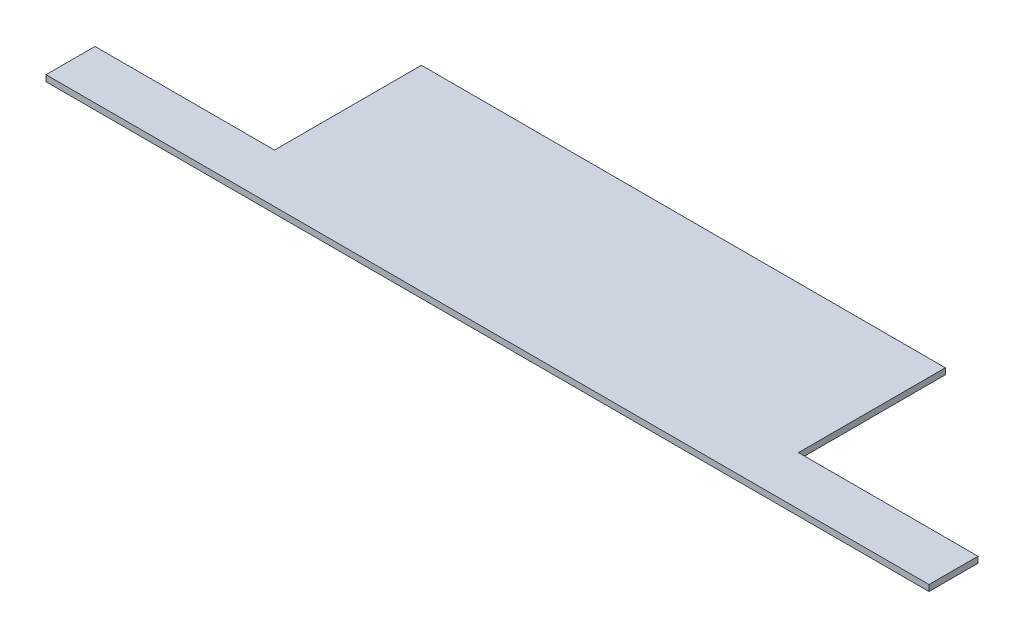
ISO-10303-21;
HEADER;
FILE_DESCRIPTION(('STEP AP214'),'2;1');
FILE_NAME('part.step','',(''),(''),'','','');
FILE_SCHEMA(('AUTOMOTIVE_DESIGN { 1 0 10303 214 1 1 1 1 }'));
ENDSEC;
DATA;
#1=APPLICATION_CONTEXT('core data for automotive mechanical design processes');
#2=APPLICATION_PROTOCOL_DEFINITION('international standard','automotive_design',2000,#1);
#3=PRODUCT_CONTEXT('',#1,'mechanical');
#4=PRODUCT('Part','Part','',(#3));
#5=PRODUCT_RELATED_PRODUCT_CATEGORY('part','',(#4));
#6=PRODUCT_DEFINITION_FORMATION('','',#4);
#7=PRODUCT_DEFINITION_CONTEXT('part definition',#1,'design');
#8=PRODUCT_DEFINITION('design','',#6,#7);
#9=PRODUCT_DEFINITION_SHAPE('','',#8);
#10=(LENGTH_UNIT() NAMED_UNIT(*) SI_UNIT(.MILLI.,.METRE.));
#11=(NAMED_UNIT(*) PLANE_ANGLE_UNIT() SI_UNIT($,.RADIAN.));
#12=(NAMED_UNIT(*) SI_UNIT($,.STERADIAN.) SOLID_ANGLE_UNIT());
#13=UNCERTAINTY_MEASURE_WITH_UNIT(LENGTH_MEASURE(1.E-05),#10,'distance_accuracy_value','');
#14=(GEOMETRIC_REPRESENTATION_CONTEXT(3) GLOBAL_UNCERTAINTY_ASSIGNED_CONTEXT((#13)) GLOBAL_UNIT_ASSIGNED_CONTEXT((#10,
#11,#12)) REPRESENTATION_CONTEXT('',''));
#15=CARTESIAN_POINT('',(0.,0.,0.));
#16=DIRECTION('',(0.,0.,1.));
#17=DIRECTION('',(1.,0.,0.));
#18=AXIS2_PLACEMENT_3D('',#15,#16,#17);
#19=CARTESIAN_POINT('',(342.899703373438,4.7625,38.4034282048035));
#20=DIRECTION('',(-1.,0.,0.));
#21=DIRECTION('',(0.,0.,1.));
#22=AXIS2_PLACEMENT_3D('',#19,#20,#21);
#23=PLANE('',#22);
#24=DIRECTION('',(0.,0.,-1.));
#25=VECTOR('',#24,1.);
#26=CARTESIAN_POINT('',(342.899703373438,0.,38.4034282048035));
#27=LINE('',#26,#25);
#28=CARTESIAN_POINT('',(342.899703373438,0.,38.4034282048035));
#29=VERTEX_POINT('',#28);
#30=CARTESIAN_POINT('',(342.899703373438,0.,0.303428204803525));
#31=VERTEX_POINT('',#30);
#32=EDGE_CURVE('E140',#29,#31,#27,.T.);
#33=ORIENTED_EDGE('',*,*,#32,.T.);
#34=DIRECTION('',(0.,-1.,0.));
#35=VECTOR('',#34,1.);
#36=CARTESIAN_POINT('',(342.899703373438,4.7625,0.303428204803525));
#37=LINE('',#36,#35);
#38=CARTESIAN_POINT('',(342.899703373438,4.7625,0.303428204803525));
#39=VERTEX_POINT('',#38);
#40=EDGE_CURVE('E11',#39,#31,#37,.T.);
#41=ORIENTED_EDGE('',*,*,#40,.F.);
#42=DIRECTION('',(0.,0.,-1.));
#43=VECTOR('',#42,1.);
#44=CARTESIAN_POINT('',(342.899703373438,4.7625,38.4034282048035));
#45=LINE('',#44,#43);
#46=CARTESIAN_POINT('',(342.899703373438,4.7625,38.4034282048035));
#47=VERTEX_POINT('',#46);
#48=EDGE_CURVE('E162',#47,#39,#45,.T.);
#49=ORIENTED_EDGE('',*,*,#48,.F.);
#50=DIRECTION('',(0.,-1.,0.));
#51=VECTOR('',#50,1.);
#52=CARTESIAN_POINT('',(342.899703373438,4.7625,38.4034282048035));
#53=LINE('',#52,#51);
#54=EDGE_CURVE('E136',#47,#29,#53,.T.);
#55=ORIENTED_EDGE('',*,*,#54,.T.);
#56=EDGE_LOOP('',(#33,#41,#49,#55));
#57=FACE_BOUND('',#56,.T.);
#58=ADVANCED_FACE('F39',(#57),#23,.F.);
#59=CARTESIAN_POINT('',(342.899703373438,4.7625,0.303428204803525));
#60=DIRECTION('',(0.,0.,1.));
#61=DIRECTION('',(1.,0.,0.));
#62=AXIS2_PLACEMENT_3D('',#59,#60,#61);
#63=PLANE('',#62);
#64=DIRECTION('',(-1.,0.,0.));
#65=VECTOR('',#64,1.);
#66=CARTESIAN_POINT('',(342.899703373438,0.,0.303428204803525));
#67=LINE('',#66,#65);
#68=CARTESIAN_POINT('',(203.199703373438,0.,0.303428204803543));
#69=VERTEX_POINT('',#68);
#70=EDGE_CURVE('E144',#31,#69,#67,.T.);
#71=ORIENTED_EDGE('',*,*,#70,.T.);
#72=DIRECTION('',(0.,-1.,0.));
#73=VECTOR('',#72,1.);
#74=CARTESIAN_POINT('',(203.199703373438,4.7625,0.303428204803543));
#75=LINE('',#74,#73);
#76=CARTESIAN_POINT('',(203.199703373438,4.7625,0.303428204803543));
#77=VERTEX_POINT('',#76);
#78=EDGE_CURVE('E48',#77,#69,#75,.T.);
#79=ORIENTED_EDGE('',*,*,#78,.F.);
#80=DIRECTION('',(-1.,0.,0.));
#81=VECTOR('',#80,1.);
#82=CARTESIAN_POINT('',(342.899703373438,4.7625,0.303428204803525));
#83=LINE('',#82,#81);
#84=EDGE_CURVE('E99',#39,#77,#83,.T.);
#85=ORIENTED_EDGE('',*,*,#84,.F.);
#86=ORIENTED_EDGE('',*,*,#40,.T.);
#87=EDGE_LOOP('',(#71,#79,#85,#86));
#88=FACE_BOUND('',#87,.T.);
#89=ADVANCED_FACE('F208',(#88),#63,.F.);
#90=CARTESIAN_POINT('',(203.199703373438,4.7625,-113.996571795197));
#91=DIRECTION('',(-1.,0.,0.));
#92=DIRECTION('',(0.,0.,1.));
#93=AXIS2_PLACEMENT_3D('',#90,#91,#92);
#94=PLANE('',#93);
#95=DIRECTION('',(0.,0.,-1.));
#96=VECTOR('',#95,1.);
#97=CARTESIAN_POINT('',(203.199703373438,0.,-113.996571795197));
#98=LINE('',#97,#96);
#99=CARTESIAN_POINT('',(203.199703373438,0.,-113.996571795197));
#100=VERTEX_POINT('',#99);
#101=EDGE_CURVE('E147',#69,#100,#98,.T.);
#102=ORIENTED_EDGE('',*,*,#101,.T.);
#103=DIRECTION('',(0.,-1.,0.));
#104=VECTOR('',#103,1.);
#105=CARTESIAN_POINT('',(203.199703373438,4.7625,-113.996571795197));
#106=LINE('',#105,#104);
#107=CARTESIAN_POINT('',(203.199703373438,4.7625,-113.996571795197));
#108=VERTEX_POINT('',#107);
#109=EDGE_CURVE('E173',#108,#100,#106,.T.);
#110=ORIENTED_EDGE('',*,*,#109,.F.);
#111=DIRECTION('',(0.,0.,-1.));
#112=VECTOR('',#111,1.);
#113=CARTESIAN_POINT('',(203.199703373438,4.7625,-113.996571795197));
#114=LINE('',#113,#112);
#115=EDGE_CURVE('E183',#77,#108,#114,.T.);
#116=ORIENTED_EDGE('',*,*,#115,.F.);
#117=ORIENTED_EDGE('',*,*,#78,.T.);
#118=EDGE_LOOP('',(#102,#110,#116,#117));
#119=FACE_BOUND('',#118,.T.);
#120=ADVANCED_FACE('F181',(#119),#94,.F.);
#121=CARTESIAN_POINT('',(203.199703373438,4.7625,-113.996571795197));
#122=DIRECTION('',(0.,0.,1.));
#123=DIRECTION('',(1.,0.,0.));
#124=AXIS2_PLACEMENT_3D('',#121,#122,#123);
#125=PLANE('',#124);
#126=DIRECTION('',(-1.,0.,0.));
#127=VECTOR('',#126,1.);
#128=CARTESIAN_POINT('',(203.199703373438,0.,-113.996571795197));
#129=LINE('',#128,#127);
#130=CARTESIAN_POINT('',(-204.511504346364,0.,-113.996571795196));
#131=VERTEX_POINT('',#130);
#132=EDGE_CURVE('E150',#100,#131,#129,.T.);
#133=ORIENTED_EDGE('',*,*,#132,.T.);
#134=DIRECTION('',(0.,-1.,0.));
#135=VECTOR('',#134,1.);
#136=CARTESIAN_POINT('',(-204.511504346364,4.7625,-113.996571795196));
#137=LINE('',#136,#135);
#138=CARTESIAN_POINT('',(-204.511504346364,4.7625,-113.996571795196));
#139=VERTEX_POINT('',#138);
#140=EDGE_CURVE('E169',#139,#131,#137,.T.);
#141=ORIENTED_EDGE('',*,*,#140,.F.);
#142=DIRECTION('',(-1.,0.,0.));
#143=VECTOR('',#142,1.);
#144=CARTESIAN_POINT('',(203.199703373438,4.7625,-113.996571795197));
#145=LINE('',#144,#143);
#146=EDGE_CURVE('E196',#108,#139,#145,.T.);
#147=ORIENTED_EDGE('',*,*,#146,.F.);
#148=ORIENTED_EDGE('',*,*,#109,.T.);
#149=EDGE_LOOP('',(#133,#141,#147,#148));
#150=FACE_BOUND('',#149,.T.);
#151=ADVANCED_FACE('F191',(#150),#125,.F.);
#152=CARTESIAN_POINT('',(-204.511504346364,4.7625,-113.996571795196));
#153=DIRECTION('',(1.,0.,0.));
#154=DIRECTION('',(0.,0.,-1.));
#155=AXIS2_PLACEMENT_3D('',#152,#153,#154);
#156=PLANE('',#155);
#157=DIRECTION('',(0.,0.,1.));
#158=VECTOR('',#157,1.);
#159=CARTESIAN_POINT('',(-204.511504346364,0.,-113.996571795196));
#160=LINE('',#159,#158);
#161=CARTESIAN_POINT('',(-204.511504346364,0.,0.303428204803525));
#162=VERTEX_POINT('',#161);
#163=EDGE_CURVE('E153',#131,#162,#160,.T.);
#164=ORIENTED_EDGE('',*,*,#163,.T.);
#165=DIRECTION('',(0.,-1.,0.));
#166=VECTOR('',#165,1.);
#167=CARTESIAN_POINT('',(-204.511504346364,4.7625,0.303428204803525));
#168=LINE('',#167,#166);
#169=CARTESIAN_POINT('',(-204.511504346364,4.7625,0.303428204803525));
#170=VERTEX_POINT('',#169);
#171=EDGE_CURVE('E129',#170,#162,#168,.T.);
#172=ORIENTED_EDGE('',*,*,#171,.F.);
#173=DIRECTION('',(0.,0.,1.));
#174=VECTOR('',#173,1.);
#175=CARTESIAN_POINT('',(-204.511504346364,4.7625,-113.996571795196));
#176=LINE('',#175,#174);
#177=EDGE_CURVE('E118',#139,#170,#176,.T.);
#178=ORIENTED_EDGE('',*,*,#177,.F.);
#179=ORIENTED_EDGE('',*,*,#140,.T.);
#180=EDGE_LOOP('',(#164,#172,#178,#179));
#181=FACE_BOUND('',#180,.T.);
#182=ADVANCED_FACE('F194',(#181),#156,.F.);
#183=CARTESIAN_POINT('',(-344.211504346364,4.7625,0.303428204803525));
#184=DIRECTION('',(0.,0.,1.));
#185=DIRECTION('',(1.,0.,0.));
#186=AXIS2_PLACEMENT_3D('',#183,#184,#185);
#187=PLANE('',#186);
#188=DIRECTION('',(-1.,0.,0.));
#189=VECTOR('',#188,1.);
#190=CARTESIAN_POINT('',(-344.211504346364,0.,0.303428204803525));
#191=LINE('',#190,#189);
#192=CARTESIAN_POINT('',(-344.211504346364,0.,0.303428204803525));
#193=VERTEX_POINT('',#192);
#194=EDGE_CURVE('E127',#162,#193,#191,.T.);
#195=ORIENTED_EDGE('',*,*,#194,.T.);
#196=DIRECTION('',(0.,-1.,0.));
#197=VECTOR('',#196,1.);
#198=CARTESIAN_POINT('',(-344.211504346364,4.7625,0.303428204803525));
#199=LINE('',#198,#197);
#200=CARTESIAN_POINT('',(-344.211504346364,4.7625,0.303428204803525));
#201=VERTEX_POINT('',#200);
#202=EDGE_CURVE('E124',#201,#193,#199,.T.);
#203=ORIENTED_EDGE('',*,*,#202,.F.);
#204=DIRECTION('',(-1.,0.,0.));
#205=VECTOR('',#204,1.);
#206=CARTESIAN_POINT('',(-344.211504346364,4.7625,0.303428204803525));
#207=LINE('',#206,#205);
#208=EDGE_CURVE('E112',#170,#201,#207,.T.);
#209=ORIENTED_EDGE('',*,*,#208,.F.);
#210=ORIENTED_EDGE('',*,*,#171,.T.);
#211=EDGE_LOOP('',(#195,#203,#209,#210));
#212=FACE_BOUND('',#211,.T.);
#213=ADVANCED_FACE('F125',(#212),#187,.F.);
#214=CARTESIAN_POINT('',(-344.211504346364,4.7625,38.4034282048036));
#215=DIRECTION('',(1.,0.,0.));
#216=DIRECTION('',(0.,0.,-1.));
#217=AXIS2_PLACEMENT_3D('',#214,#215,#216);
#218=PLANE('',#217);
#219=DIRECTION('',(0.,0.,1.));
#220=VECTOR('',#219,1.);
#221=CARTESIAN_POINT('',(-344.211504346364,0.,38.4034282048036));
#222=LINE('',#221,#220);
#223=CARTESIAN_POINT('',(-344.211504346364,0.,38.4034282048036));
#224=VERTEX_POINT('',#223);
#225=EDGE_CURVE('E85',#193,#224,#222,.T.);
#226=ORIENTED_EDGE('',*,*,#225,.T.);
#227=DIRECTION('',(0.,-1.,0.));
#228=VECTOR('',#227,1.);
#229=CARTESIAN_POINT('',(-344.211504346364,4.7625,38.4034282048036));
#230=LINE('',#229,#228);
#231=CARTESIAN_POINT('',(-344.211504346364,4.7625,38.4034282048036));
#232=VERTEX_POINT('',#231);
#233=EDGE_CURVE('E130',#232,#224,#230,.T.);
#234=ORIENTED_EDGE('',*,*,#233,.F.);
#235=DIRECTION('',(0.,0.,1.));
#236=VECTOR('',#235,1.);
#237=CARTESIAN_POINT('',(-344.211504346364,4.7625,38.4034282048036));
#238=LINE('',#237,#236);
#239=EDGE_CURVE('E116',#201,#232,#238,.T.);
#240=ORIENTED_EDGE('',*,*,#239,.F.);
#241=ORIENTED_EDGE('',*,*,#202,.T.);
#242=EDGE_LOOP('',(#226,#234,#240,#241));
#243=FACE_BOUND('',#242,.T.);
#244=ADVANCED_FACE('F132',(#243),#218,.F.);
#245=CARTESIAN_POINT('',(342.899703373438,4.7625,38.4034282048035));
#246=DIRECTION('',(0.,0.,-1.));
#247=DIRECTION('',(-1.,0.,0.));
#248=AXIS2_PLACEMENT_3D('',#245,#246,#247);
#249=PLANE('',#248);
#250=DIRECTION('',(1.,0.,0.));
#251=VECTOR('',#250,1.);
#252=CARTESIAN_POINT('',(342.899703373438,0.,38.4034282048035));
#253=LINE('',#252,#251);
#254=EDGE_CURVE('E91',#224,#29,#253,.T.);
#255=ORIENTED_EDGE('',*,*,#254,.T.);
#256=ORIENTED_EDGE('',*,*,#54,.F.);
#257=DIRECTION('',(1.,0.,0.));
#258=VECTOR('',#257,1.);
#259=CARTESIAN_POINT('',(342.899703373438,4.7625,38.4034282048035));
#260=LINE('',#259,#258);
#261=EDGE_CURVE('E56',#232,#47,#260,.T.);
#262=ORIENTED_EDGE('',*,*,#261,.F.);
#263=ORIENTED_EDGE('',*,*,#233,.T.);
#264=EDGE_LOOP('',(#255,#256,#262,#263));
#265=FACE_BOUND('',#264,.T.);
#266=ADVANCED_FACE('F224',(#265),#249,.F.);
#267=CARTESIAN_POINT('',(0.,4.7625,0.));
#268=DIRECTION('',(0.,1.,0.));
#269=DIRECTION('',(0.,0.,1.));
#270=AXIS2_PLACEMENT_3D('',#267,#268,#269);
#271=PLANE('',#270);
#272=ORIENTED_EDGE('',*,*,#48,.T.);
#273=ORIENTED_EDGE('',*,*,#84,.T.);
#274=ORIENTED_EDGE('',*,*,#115,.T.);
#275=ORIENTED_EDGE('',*,*,#146,.T.);
#276=ORIENTED_EDGE('',*,*,#177,.T.);
#277=ORIENTED_EDGE('',*,*,#208,.T.);
#278=ORIENTED_EDGE('',*,*,#239,.T.);
#279=ORIENTED_EDGE('',*,*,#261,.T.);
#280=EDGE_LOOP('',(#272,#273,#274,#275,#276,#277,#278,#279));
#281=FACE_BOUND('',#280,.T.);
#282=ADVANCED_FACE('F114',(#281),#271,.T.);
#283=CARTESIAN_POINT('',(0.,0.,0.));
#284=DIRECTION('',(0.,1.,0.));
#285=DIRECTION('',(0.,0.,1.));
#286=AXIS2_PLACEMENT_3D('',#283,#284,#285);
#287=PLANE('',#286);
#288=ORIENTED_EDGE('',*,*,#32,.F.);
#289=ORIENTED_EDGE('',*,*,#254,.F.);
#290=ORIENTED_EDGE('',*,*,#225,.F.);
#291=ORIENTED_EDGE('',*,*,#194,.F.);
#292=ORIENTED_EDGE('',*,*,#163,.F.);
#293=ORIENTED_EDGE('',*,*,#132,.F.);
#294=ORIENTED_EDGE('',*,*,#101,.F.);
#295=ORIENTED_EDGE('',*,*,#70,.F.);
#296=EDGE_LOOP('',(#288,#289,#290,#291,#292,#293,#294,#295));
#297=FACE_BOUND('',#296,.T.);
#298=ADVANCED_FACE('F187',(#297),#287,.F.);
#299=CLOSED_SHELL('',(#58,#89,#120,#151,#182,#213,#244,#266,#282,#298));
#300=MANIFOLD_SOLID_BREP('B2',#299);
#301=ADVANCED_BREP_SHAPE_REPRESENTATION('',(#18,#300),#14);
#302=SHAPE_DEFINITION_REPRESENTATION(#9,#301);
ENDSEC;
END-ISO-10303-21;
